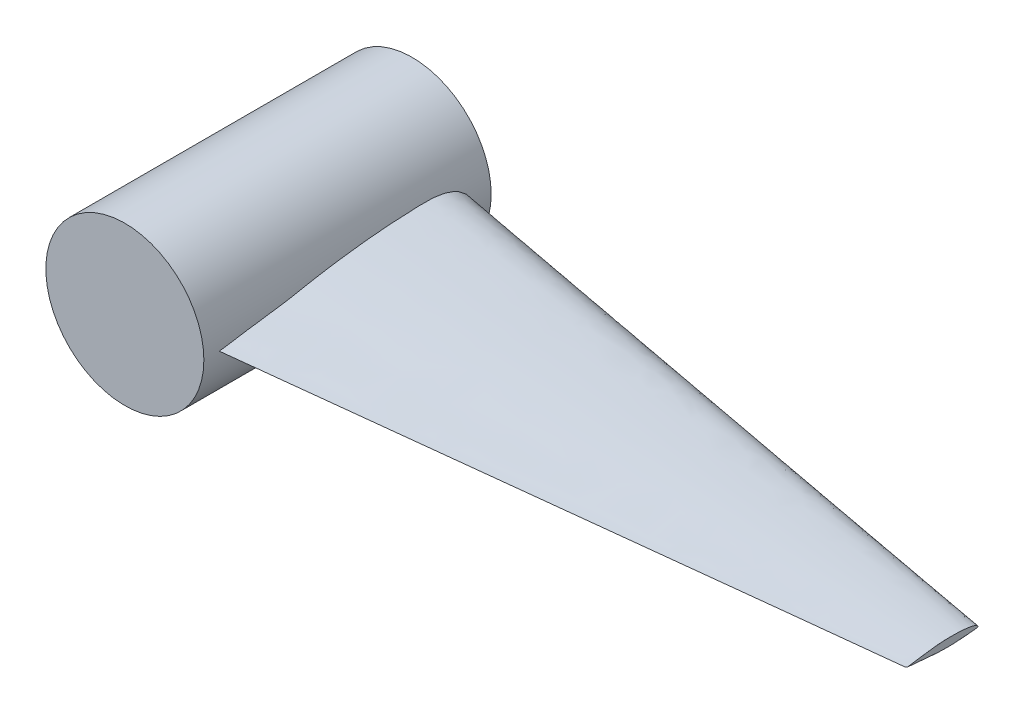
ISO-10303-21;
HEADER;
FILE_DESCRIPTION(('STEP AP214'),'2;1');
FILE_NAME('part.step','',(''),(''),'','','');
FILE_SCHEMA(('AUTOMOTIVE_DESIGN { 1 0 10303 214 1 1 1 1 }'));
ENDSEC;
DATA;
#1=APPLICATION_CONTEXT('core data for automotive mechanical design processes');
#2=APPLICATION_PROTOCOL_DEFINITION('international standard','automotive_design',2000,#1);
#3=PRODUCT_CONTEXT('',#1,'mechanical');
#4=PRODUCT('Part','Part','',(#3));
#5=PRODUCT_RELATED_PRODUCT_CATEGORY('part','',(#4));
#6=PRODUCT_DEFINITION_FORMATION('','',#4);
#7=PRODUCT_DEFINITION_CONTEXT('part definition',#1,'design');
#8=PRODUCT_DEFINITION('design','',#6,#7);
#9=PRODUCT_DEFINITION_SHAPE('','',#8);
#10=(LENGTH_UNIT() NAMED_UNIT(*) SI_UNIT(.MILLI.,.METRE.));
#11=(NAMED_UNIT(*) PLANE_ANGLE_UNIT() SI_UNIT($,.RADIAN.));
#12=(NAMED_UNIT(*) SI_UNIT($,.STERADIAN.) SOLID_ANGLE_UNIT());
#13=UNCERTAINTY_MEASURE_WITH_UNIT(LENGTH_MEASURE(1.E-05),#10,'distance_accuracy_value','');
#14=(GEOMETRIC_REPRESENTATION_CONTEXT(3) GLOBAL_UNCERTAINTY_ASSIGNED_CONTEXT((#13)) GLOBAL_UNIT_ASSIGNED_CONTEXT((#10,
#11,#12)) REPRESENTATION_CONTEXT('',''));
#15=CARTESIAN_POINT('',(0.,0.,0.));
#16=DIRECTION('',(0.,0.,1.));
#17=DIRECTION('',(1.,0.,0.));
#18=AXIS2_PLACEMENT_3D('',#15,#16,#17);
#19=CARTESIAN_POINT('',(0.,0.,-254.));
#20=DIRECTION('',(0.,0.,1.));
#21=DIRECTION('',(1.,0.,0.));
#22=AXIS2_PLACEMENT_3D('',#19,#20,#21);
#23=CYLINDRICAL_SURFACE('',#22,139.7);
#24=CARTESIAN_POINT('',(0.,0.,-254.));
#25=DIRECTION('',(0.,0.,1.));
#26=DIRECTION('',(1.,0.,0.));
#27=AXIS2_PLACEMENT_3D('',#24,#25,#26);
#28=CIRCLE('',#27,139.7);
#29=CARTESIAN_POINT('',(139.7,0.,-254.));
#30=VERTEX_POINT('',#29);
#31=EDGE_CURVE('E13',#30,#30,#28,.T.);
#32=ORIENTED_EDGE('',*,*,#31,.T.);
#33=EDGE_LOOP('',(#32));
#34=FACE_BOUND('',#33,.T.);
#35=CARTESIAN_POINT('',(0.,0.,254.));
#36=DIRECTION('',(0.,0.,1.));
#37=DIRECTION('',(1.,0.,0.));
#38=AXIS2_PLACEMENT_3D('',#35,#36,#37);
#39=CIRCLE('',#38,139.7);
#40=CARTESIAN_POINT('',(139.7,0.,254.));
#41=VERTEX_POINT('',#40);
#42=EDGE_CURVE('E91',#41,#41,#39,.T.);
#43=ORIENTED_EDGE('',*,*,#42,.F.);
#44=EDGE_LOOP('',(#43));
#45=FACE_BOUND('',#44,.T.);
#46=ADVANCED_FACE('F85',(#34,#45),#23,.T.);
#47=CARTESIAN_POINT('',(0.,0.,-254.));
#48=DIRECTION('',(0.,0.,1.));
#49=DIRECTION('',(1.,0.,0.));
#50=AXIS2_PLACEMENT_3D('',#47,#48,#49);
#51=PLANE('',#50);
#52=ORIENTED_EDGE('',*,*,#31,.F.);
#53=EDGE_LOOP('',(#52));
#54=FACE_BOUND('',#53,.T.);
#55=ADVANCED_FACE('F100',(#54),#51,.F.);
#56=CARTESIAN_POINT('',(0.,0.,254.));
#57=DIRECTION('',(0.,0.,1.));
#58=DIRECTION('',(1.,0.,0.));
#59=AXIS2_PLACEMENT_3D('',#56,#57,#58);
#60=PLANE('',#59);
#61=ORIENTED_EDGE('',*,*,#42,.T.);
#62=EDGE_LOOP('',(#61));
#63=FACE_BOUND('',#62,.T.);
#64=ADVANCED_FACE('F97',(#63),#60,.T.);
#65=CLOSED_SHELL('',(#46,#55,#64));
#66=MANIFOLD_SOLID_BREP('B2',#65);
#67=CARTESIAN_POINT('',(1231.9,2.62273754624969E-12,2.62273754624969E-12));
#68=DIRECTION('',(1.,0.,0.));
#69=DIRECTION('',(0.,0.,-1.));
#70=AXIS2_PLACEMENT_3D('',#67,#68,#69);
#71=PLANE('',#70);
#72=CARTESIAN_POINT('',(1231.9,0.1003808,102.934907375439));
#73=CARTESIAN_POINT('',(1231.9,0.0578525268354139,103.250356661608));
#74=CARTESIAN_POINT('',(1231.9,0.0153242536708278,103.565805947778));
#75=CARTESIAN_POINT('',(1231.9,-0.0272040194937584,103.881255233947));
#76=CARTESIAN_POINT('',(1231.9,-0.0272261396690082,103.881419308173));
#77=CARTESIAN_POINT('',(1231.9,-0.0272703800195081,103.881747456625));
#78=CARTESIAN_POINT('',(1231.9,-0.0286565308094481,103.88175049087));
#79=CARTESIAN_POINT('',(1231.9,-0.0286815415989882,103.881420319588));
#80=CARTESIAN_POINT('',(1231.9,-0.0286940469937583,103.881255233947));
#81=CARTESIAN_POINT('',(1231.9,-0.0525896313291721,103.565805947778));
#82=CARTESIAN_POINT('',(1231.9,-0.0764852156645861,103.250356661608));
#83=CARTESIAN_POINT('',(1231.9,-0.1003808,102.934907375439));
#84=CARTESIAN_POINT('',(1231.9,-0.417269682202413,98.7516084745762));
#85=CARTESIAN_POINT('',(1231.9,-1.0512540013073,90.3822839124685));
#86=CARTESIAN_POINT('',(1231.9,-2.17070698962965,77.8410792882466));
#87=CARTESIAN_POINT('',(1231.9,-3.21498348376973,65.2924448238588));
#88=CARTESIAN_POINT('',(1231.9,-4.13319408439642,54.8424833197852));
#89=CARTESIAN_POINT('',(1231.9,-4.67705432307556,46.4741424696112));
#90=CARTESIAN_POINT('',(1231.9,-4.95235359886187,40.1992202803191));
#91=CARTESIAN_POINT('',(1231.9,-5.10030374065839,33.9237788363238));
#92=CARTESIAN_POINT('',(1231.9,-5.06174329405863,27.6484477116856));
#93=CARTESIAN_POINT('',(1231.9,-4.91739345156604,21.3704487859247));
#94=CARTESIAN_POINT('',(1231.9,-4.47861824253753,15.103393193739));
#95=CARTESIAN_POINT('',(1231.9,-4.19541807838513,8.82179561143663));
#96=CARTESIAN_POINT('',(1231.9,-3.65754706539852,2.5515599119799));
#97=CARTESIAN_POINT('',(1231.9,-3.08108017308395,-3.71951164523088));
#98=CARTESIAN_POINT('',(1231.9,-2.62840657573793,-8.95113783479889));
#99=CARTESIAN_POINT('',(1231.9,-2.18061623347464,-13.1304478154078));
#100=CARTESIAN_POINT('',(1231.9,-1.86028146891209,-16.2692997273482));
#101=CARTESIAN_POINT('',(1231.9,-1.57477758176331,-18.8973433944753));
#102=CARTESIAN_POINT('',(1231.9,-1.21744020538741,-20.6635410878993));
#103=CARTESIAN_POINT('',(1231.9,-1.01649086180921,-21.5093293946328));
#104=CARTESIAN_POINT('',(1231.9,-0.827015652011224,-21.9209623295264));
#105=CARTESIAN_POINT('',(1231.9,-0.611069386440118,-22.348919571251));
#106=CARTESIAN_POINT('',(1231.9,0.0809911515844077,-22.6778303421969));
#107=CARTESIAN_POINT('',(1231.9,0.779185751573777,-22.3300581965528));
#108=CARTESIAN_POINT('',(1231.9,1.24585794147608,-21.9365230234994));
#109=CARTESIAN_POINT('',(1231.9,1.62757054457892,-21.5155439232277));
#110=CARTESIAN_POINT('',(1231.9,2.21558407901577,-20.698730076763));
#111=CARTESIAN_POINT('',(1231.9,3.19627291612298,-18.9553504155205));
#112=CARTESIAN_POINT('',(1231.9,4.2382336433096,-16.3193241977378));
#113=CARTESIAN_POINT('',(1231.9,5.17140663030088,-13.156390559054));
#114=CARTESIAN_POINT('',(1231.9,6.13468412144805,-8.97980553439834));
#115=CARTESIAN_POINT('',(1231.9,6.92396433800448,-3.7372285578663));
#116=CARTESIAN_POINT('',(1231.9,7.6434797599233,2.5419973575698));
#117=CARTESIAN_POINT('',(1231.9,8.11812753159619,8.82150905615575));
#118=CARTESIAN_POINT('',(1231.9,8.29053392869502,15.1017420779062));
#119=CARTESIAN_POINT('',(1231.9,8.558534989163,21.3734191008187));
#120=CARTESIAN_POINT('',(1231.9,8.51880528719244,27.6501142954071));
#121=CARTESIAN_POINT('',(1231.9,8.40982488462759,33.9254297873578));
#122=CARTESIAN_POINT('',(1231.9,8.13218611071437,40.2015509300742));
#123=CARTESIAN_POINT('',(1231.9,7.69431195149048,46.4775249510334));
#124=CARTESIAN_POINT('',(1231.9,6.88340368473107,54.8521651477331));
#125=CARTESIAN_POINT('',(1231.9,5.5209907762197,65.3092190404685));
#126=CARTESIAN_POINT('',(1231.9,3.64824659602947,77.8391627436256));
#127=CARTESIAN_POINT('',(1231.9,1.79323804069325,90.378305180543));
#128=CARTESIAN_POINT('',(1231.9,0.664431665266303,98.7511155218887));
#129=CARTESIAN_POINT('',(1231.9,0.1003808,102.934907375439));
#130=B_SPLINE_CURVE_WITH_KNOTS('',3,(#72,#73,#74,#75,#76,#77,#78,#79,#80,#81,#82,#83,#84,#85,
#86,#87,#88,#89,#90,#91,#92,#93,#94,#95,#96,#97,#98,#99,#100,#101,#102,#103,#104,#105,#106,#107,
#108,#109,#110,#111,#112,#113,#114,#115,#116,#117,#118,#119,#120,#121,#122,#123,#124,#125,#126,
#127,#128,#129),.UNSPECIFIED.,.T.,.F.,(4,3,1,1,3,3,1,1,1,1,1,1,1,1,1,1,1,1,1,1,1,1,1,1,1,1,1,1,
1,1,1,1,1,1,1,1,1,1,1,1,1,1,1,1,1,1,1,1,1,4),(0.,0.00372715795143563,0.0037290965532395,
0.00373103515504325,0.00373297375684711,0.00743729687078698,0.0565618043285644,
0.105718332152071,0.154870687771699,0.204010817526637,0.228548792017455,0.253060359391852,
0.277554159314199,0.302042229789993,0.326539701729691,0.35106873032683,0.375594971831613,
0.400161082625523,0.424747933069218,0.449339221964373,0.461649196379859,0.473959170795345,
0.486303002909542,0.492546210424397,0.495089179224088,0.496426853888338,0.497854730074794,
0.500636449154535,0.504276833423401,0.506189397567921,0.507853131952137,0.510899486539756,
0.517964397502406,0.531206791634393,0.54398983744939,0.556558965161132,0.581366088598264,
0.606012571725114,0.630567402561298,0.655072951002357,0.679573360159687,0.704061234733268,
0.728554006392103,0.753065573766501,0.777613370318065,0.802213826225178,0.851576813971277,
0.901071794260254,0.95056677454923,1.),.UNSPECIFIED.);
#131=CARTESIAN_POINT('',(1231.9,0.1003808,102.934907375439));
#132=VERTEX_POINT('',#131);
#133=EDGE_CURVE('E84',#132,#132,#130,.T.);
#134=ORIENTED_EDGE('',*,*,#133,.T.);
#135=EDGE_LOOP('',(#134));
#136=FACE_BOUND('',#135,.T.);
#137=ADVANCED_FACE('F139',(#136),#71,.T.);
#138=OPEN_SHELL('',(#137));
#139=SHELL_BASED_SURFACE_MODEL('B8',(#138));
#140=CARTESIAN_POINT('',(0.,0.,0.));
#141=DIRECTION('',(-1.,0.,0.));
#142=DIRECTION('',(0.,0.,1.));
#143=AXIS2_PLACEMENT_3D('',#140,#141,#142);
#144=PLANE('',#143);
#145=CARTESIAN_POINT('',(0.,0.144788443865577,241.299944654891));
#146=CARTESIAN_POINT('',(0.,0.0777003705492685,241.895364525818));
#147=CARTESIAN_POINT('',(0.,-0.0567866928298426,243.102704480422));
#148=CARTESIAN_POINT('',(0.,-0.147058392792937,241.23256915172));
#149=CARTESIAN_POINT('',(0.,-0.301491598593268,238.25172523764));
#150=CARTESIAN_POINT('',(0.,-1.03994476595416,225.838699740826));
#151=CARTESIAN_POINT('',(0.,-2.66200675131926,213.281180425386));
#152=CARTESIAN_POINT('',(0.,-4.73930316036072,188.634037520463));
#153=CARTESIAN_POINT('',(0.,-6.92135758938836,161.713152289455));
#154=CARTESIAN_POINT('',(0.,-10.53016706284,128.183115663699));
#155=CARTESIAN_POINT('',(0.,-14.4426517985778,99.4388123296694));
#156=CARTESIAN_POINT('',(0.,-18.2272169843898,70.864003289634));
#157=CARTESIAN_POINT('',(0.,-20.253473736349,54.5188584987011));
#158=CARTESIAN_POINT('',(0.,-21.9546617619918,39.5655706179138));
#159=CARTESIAN_POINT('',(0.,-23.1816635838245,27.8472314383957));
#160=CARTESIAN_POINT('',(0.,-24.3821935637638,15.128115176118));
#161=CARTESIAN_POINT('',(0.,-25.373961820276,3.39492600133725));
#162=CARTESIAN_POINT('',(0.,-26.3305691423975,-9.32996665794859));
#163=CARTESIAN_POINT('',(0.,-27.120662220444,-21.0810026259953));
#164=CARTESIAN_POINT('',(0.,-27.9673106163807,-34.9441944839179));
#165=CARTESIAN_POINT('',(0.,-28.5839513658834,-46.7061128950724));
#166=CARTESIAN_POINT('',(0.,-29.0911822573746,-58.6204981027553));
#167=CARTESIAN_POINT('',(0.,-29.4746092400472,-69.2582244915911));
#168=CARTESIAN_POINT('',(0.,-29.8840788266327,-83.202586351335));
#169=CARTESIAN_POINT('',(0.,-30.1591022699629,-95.8198922370995));
#170=CARTESIAN_POINT('',(0.,-30.3725010986781,-108.735724295835));
#171=CARTESIAN_POINT('',(0.,-30.4993261611017,-119.342275085077));
#172=CARTESIAN_POINT('',(0.,-30.5912498673501,-132.871805304554));
#173=CARTESIAN_POINT('',(0.,-30.5586387264164,-144.536287645946));
#174=CARTESIAN_POINT('',(0.,-30.3339801622526,-157.416352533227));
#175=CARTESIAN_POINT('',(0.,-29.6401732545879,-168.461688270843));
#176=CARTESIAN_POINT('',(0.,-27.4489271373718,-181.186817565267));
#177=CARTESIAN_POINT('',(0.,-25.0161188932733,-192.736720588934));
#178=CARTESIAN_POINT('',(0.,-23.6431038958614,-201.820139323343));
#179=CARTESIAN_POINT('',(0.,-21.3848922659402,-208.993581592136));
#180=CARTESIAN_POINT('',(0.,-18.9788039920874,-213.419469026814));
#181=CARTESIAN_POINT('',(0.,-15.3623977535589,-219.868370753213));
#182=CARTESIAN_POINT('',(0.,-12.894139184339,-224.66955517833));
#183=CARTESIAN_POINT('',(0.,-9.22987213402648,-230.663299255344));
#184=CARTESIAN_POINT('',(0.,-6.71852338724773,-233.968825808489));
#185=CARTESIAN_POINT('',(0.,-4.10135768701016,-236.571547446773));
#186=CARTESIAN_POINT('',(0.,-2.72873738723392,-237.763146443635));
#187=CARTESIAN_POINT('',(0.,-0.978430841697623,-238.902008655179));
#188=CARTESIAN_POINT('',(0.,0.502851479557123,-239.691823096477));
#189=CARTESIAN_POINT('',(0.,1.80350011732377,-240.246218422895));
#190=CARTESIAN_POINT('',(0.,3.03667337681265,-240.651682084256));
#191=CARTESIAN_POINT('',(0.,4.34014889838884,-240.966654055654));
#192=CARTESIAN_POINT('',(0.,6.18350502042997,-241.257871564671));
#193=CARTESIAN_POINT('',(0.,7.60604770037491,-241.320092940452));
#194=CARTESIAN_POINT('',(0.,9.76693419163617,-241.27370421335));
#195=CARTESIAN_POINT('',(0.,11.6248227085678,-241.073687442578));
#196=CARTESIAN_POINT('',(0.,13.7267415137745,-240.566764917199));
#197=CARTESIAN_POINT('',(0.,14.8690618467352,-240.210231458943));
#198=CARTESIAN_POINT('',(0.,16.19500583098,-239.73883673656));
#199=CARTESIAN_POINT('',(0.,17.3588098425809,-239.217044838416));
#200=CARTESIAN_POINT('',(0.,18.8087632732904,-238.417711904317));
#201=CARTESIAN_POINT('',(0.,20.9488980726215,-237.070120775956));
#202=CARTESIAN_POINT('',(0.,22.8575837599116,-235.625177997857));
#203=CARTESIAN_POINT('',(0.,25.6006483962156,-232.877202438314));
#204=CARTESIAN_POINT('',(0.,28.1478136488566,-229.22455492491));
#205=CARTESIAN_POINT('',(0.,31.9659718128666,-223.57034603849));
#206=CARTESIAN_POINT('',(0.,35.1600228976263,-217.905910600061));
#207=CARTESIAN_POINT('',(0.,37.5541079201024,-211.820830692384));
#208=CARTESIAN_POINT('',(0.,39.2479011652027,-205.930592941204));
#209=CARTESIAN_POINT('',(0.,40.709432435659,-199.712498758831));
#210=CARTESIAN_POINT('',(0.,42.5589668570684,-189.680098753831));
#211=CARTESIAN_POINT('',(0.,43.4757033161673,-178.803635209961));
#212=CARTESIAN_POINT('',(0.,43.8857537485595,-164.447888477241));
#213=CARTESIAN_POINT('',(0.,43.8375966604243,-154.906565743939));
#214=CARTESIAN_POINT('',(0.,43.5703567957637,-141.09760373014));
#215=CARTESIAN_POINT('',(0.,43.2450367586771,-131.046005488648));
#216=CARTESIAN_POINT('',(0.,42.6258920136827,-115.991835855987));
#217=CARTESIAN_POINT('',(0.,42.0807353396725,-104.645610739935));
#218=CARTESIAN_POINT('',(0.,41.314111352033,-90.1610334428075));
#219=CARTESIAN_POINT('',(0.,40.7549990560645,-80.1339686227491));
#220=CARTESIAN_POINT('',(0.,39.9247512735249,-66.9815801589921));
#221=CARTESIAN_POINT('',(0.,39.3113973137302,-58.7065326735991));
#222=CARTESIAN_POINT('',(0.,38.1835096253861,-44.2584932724856));
#223=CARTESIAN_POINT('',(0.,37.4284832313508,-35.1579041671688));
#224=CARTESIAN_POINT('',(0.,35.8919605824467,-18.9912942708213));
#225=CARTESIAN_POINT('',(0.,34.8340583599446,-9.08206591022316));
#226=CARTESIAN_POINT('',(0.,33.0586087758142,6.24338828354298));
#227=CARTESIAN_POINT('',(0.,31.7315455084347,17.0089907089954));
#228=CARTESIAN_POINT('',(0.,29.838396629525,31.5111275878528));
#229=CARTESIAN_POINT('',(0.,28.6616840468253,40.1128211772237));
#230=CARTESIAN_POINT('',(0.,26.6257553230861,54.5293601900039));
#231=CARTESIAN_POINT('',(0.,24.2069282610959,70.9006052459385));
#232=CARTESIAN_POINT('',(0.,19.2422421117045,102.604407703476));
#233=CARTESIAN_POINT('',(0.,14.6288568753775,132.013301323053));
#234=CARTESIAN_POINT('',(0.,10.2330235514548,165.674575774059));
#235=CARTESIAN_POINT('',(0.,8.12252718520493,185.465808698908));
#236=CARTESIAN_POINT('',(0.,4.85207414209411,209.607389259597));
#237=CARTESIAN_POINT('',(0.,2.55003100328343,219.952942967667));
#238=CARTESIAN_POINT('',(0.,0.144788443865577,241.299944654891));
#239=B_SPLINE_CURVE_WITH_KNOTS('',3,(#145,#146,#147,#148,#149,#150,#151,#152,#153,#154,#155,
#156,#157,#158,#159,#160,#161,#162,#163,#164,#165,#166,#167,#168,#169,#170,#171,#172,#173,#174,
#175,#176,#177,#178,#179,#180,#181,#182,#183,#184,#185,#186,#187,#188,#189,#190,#191,#192,#193,
#194,#195,#196,#197,#198,#199,#200,#201,#202,#203,#204,#205,#206,#207,#208,#209,#210,#211,#212,
#213,#214,#215,#216,#217,#218,#219,#220,#221,#222,#223,#224,#225,#226,#227,#228,#229,#230,#231,
#232,#233,#234,#235,#236,#237,#238),.UNSPECIFIED.,.T.,.F.,(4,1,1,1,1,1,1,1,1,1,1,1,1,1,1,1,1,1,
1,1,1,1,1,1,1,1,1,1,1,1,1,1,1,1,1,1,1,1,1,1,1,1,1,1,1,1,1,1,1,1,1,1,1,1,1,1,1,1,1,1,1,1,1,1,1,1,
1,1,1,1,1,1,1,1,1,1,1,1,1,1,1,1,1,1,1,1,1,1,1,1,1,4),(0.,0.00120988816400813,
0.00241459661074461,0.00372715795143563,0.00743729687078698,0.0309433201539792,
0.0565618043285644,0.0838079601235979,0.105718332152071,0.154870687771699,0.1727447748775,
0.193230964335824,0.204010817526637,0.217802078697554,0.228548792017455,0.242277916839808,
0.253060359391852,0.266767219292103,0.277554159314199,0.294658520933296,0.302042229789993,
0.313270448670582,0.326539701729691,0.343826968977655,0.35106873032683,0.36522131450135,
0.375594971831613,0.391624537462875,0.400161082625523,0.41406108851159,0.424747933069218,
0.438974099827609,0.449339221964373,0.45196066184842,0.461649196379859,0.464350317244791,
0.473959170795345,0.477814575652468,0.485429622889384,0.486303002909542,0.488842665522006,
0.490860526208461,0.492546210424397,0.493855900746361,0.495089179224088,0.496426853888338,
0.497854730074794,0.500636433341055,0.500636449154535,0.504276833423401,0.506189397567921,
0.507092156527246,0.507853131952137,0.510394580976236,0.510899486539756,0.512815649468572,
0.517964397502406,0.517992592110853,0.52447916633929,0.531206791634393,0.538311411882904,
0.54398983744939,0.550790307406691,0.556558965161132,0.563093377662114,0.581366088598264,
0.589186037278411,0.606012571725114,0.609952299352341,0.630567402561298,0.636128987509159,
0.655072951002357,0.664590133650393,0.679573360159687,0.685150580539931,0.704061234733268,
0.704425535399166,0.728554006392103,0.731409856246585,0.753065573766501,0.758401961531186,
0.777613370318065,0.785545524030473,0.802213826225178,0.803636535083191,0.829106870133368,
0.851576813971277,0.901071794260254,0.919833809060581,0.95056677454923,0.956623072323336,1.),.UNSPECIFIED.);
#240=CARTESIAN_POINT('',(0.,0.144788443865577,241.299944654891));
#241=VERTEX_POINT('',#240);
#242=EDGE_CURVE('E138',#241,#241,#239,.T.);
#243=ORIENTED_EDGE('',*,*,#242,.F.);
#244=EDGE_LOOP('',(#243));
#245=FACE_BOUND('',#244,.T.);
#246=ADVANCED_FACE('F167',(#245),#144,.T.);
#247=OPEN_SHELL('',(#246));
#248=SHELL_BASED_SURFACE_MODEL('B79',(#247));
#249=CARTESIAN_POINT('',(0.,0.144788443865577,241.299944654891));
#250=CARTESIAN_POINT('',(1231.9,0.100380742666225,102.934907800706));
#251=CARTESIAN_POINT('',(0.,0.0777003705492685,241.895364525818));
#252=CARTESIAN_POINT('',(1231.9,0.0852006497967138,103.085588380846));
#253=CARTESIAN_POINT('',(0.,-0.0567866928298426,243.102704480422));
#254=CARTESIAN_POINT('',(1231.9,0.0547891454309801,103.390388923212));
#255=CARTESIAN_POINT('',(0.,-0.147058392792937,241.23256915172));
#256=CARTESIAN_POINT('',(1231.9,0.01050872858406,103.767370963349));
#257=CARTESIAN_POINT('',(0.,-0.301491598593268,238.25172523764));
#258=CARTESIAN_POINT('',(1231.9,-0.0535984612337215,104.050362792936));
#259=CARTESIAN_POINT('',(0.,-1.03994476595416,225.838699740826));
#260=CARTESIAN_POINT('',(1231.9,-0.204815880802011,100.34357994304));
#261=CARTESIAN_POINT('',(0.,-2.66200675131926,213.281180425386));
#262=CARTESIAN_POINT('',(1231.9,-0.536435390463784,95.4861051607936));
#263=CARTESIAN_POINT('',(0.,-4.73930316036072,188.634037520463));
#264=CARTESIAN_POINT('',(1231.9,-1.08956009040158,90.5264327571759));
#265=CARTESIAN_POINT('',(0.,-6.92135758938836,161.713152289455));
#266=CARTESIAN_POINT('',(1231.9,-1.63909134888173,84.195768363094));
#267=CARTESIAN_POINT('',(0.,-10.53016706284,128.183115663699));
#268=CARTESIAN_POINT('',(1231.9,-2.358908689239,75.3368677011081));
#269=CARTESIAN_POINT('',(0.,-14.4426517985778,99.4388123296694));
#270=CARTESIAN_POINT('',(1231.9,-2.99357144661155,67.9542379355756));
#271=CARTESIAN_POINT('',(0.,-18.2272169843898,70.864003289634));
#272=CARTESIAN_POINT('',(1231.9,-3.63738888679172,60.5302520487528));
#273=CARTESIAN_POINT('',(0.,-20.253473736349,54.5188584987011));
#274=CARTESIAN_POINT('',(1231.9,-3.98500279705649,56.3340881440189));
#275=CARTESIAN_POINT('',(0.,-21.9546617619918,39.5655706179138));
#276=CARTESIAN_POINT('',(1231.9,-4.27611885051255,52.4864729742628));
#277=CARTESIAN_POINT('',(0.,-23.1816635838245,27.8472314383957));
#278=CARTESIAN_POINT('',(1231.9,-4.48171270688213,49.4771113983404));
#279=CARTESIAN_POINT('',(0.,-24.3821935637638,15.128115176118));
#280=CARTESIAN_POINT('',(1231.9,-4.67441339819583,46.2171620509656));
#281=CARTESIAN_POINT('',(0.,-25.373961820276,3.39492600133725));
#282=CARTESIAN_POINT('',(1231.9,-4.8203154147618,43.2096137818323));
#283=CARTESIAN_POINT('',(0.,-26.3305691423975,-9.32996665794859));
#284=CARTESIAN_POINT('',(1231.9,-4.94483789655141,39.9473584652721));
#285=CARTESIAN_POINT('',(0.,-27.120662220444,-21.0810026259953));
#286=CARTESIAN_POINT('',(1231.9,-5.02928775323337,36.9356926222336));
#287=CARTESIAN_POINT('',(0.,-27.9673106163807,-34.9441944839179));
#288=CARTESIAN_POINT('',(1231.9,-5.08349160670443,33.3837364243269));
#289=CARTESIAN_POINT('',(0.,-28.5839513658834,-46.7061128950724));
#290=CARTESIAN_POINT('',(1231.9,-5.07847468497302,30.3712165569801));
#291=CARTESIAN_POINT('',(0.,-29.0911822573746,-58.6204981027553));
#292=CARTESIAN_POINT('',(1231.9,-5.04178740813958,27.3209702680804));
#293=CARTESIAN_POINT('',(0.,-29.4746092400472,-69.2582244915911));
#294=CARTESIAN_POINT('',(1231.9,-4.99161213226085,24.59833585927));
#295=CARTESIAN_POINT('',(0.,-29.8840788266327,-83.202586351335));
#296=CARTESIAN_POINT('',(1231.9,-4.87126903824623,21.0318649053898));
#297=CARTESIAN_POINT('',(0.,-30.1591022699629,-95.8198922370995));
#298=CARTESIAN_POINT('',(1231.9,-4.6681287341707,17.8101856041861));
#299=CARTESIAN_POINT('',(0.,-30.3725010986781,-108.735724295835));
#300=CARTESIAN_POINT('',(1231.9,-4.46625712954357,14.5127092042189));
#301=CARTESIAN_POINT('',(0.,-30.4993261611017,-119.342275085077));
#302=CARTESIAN_POINT('',(1231.9,-4.32982124496079,11.8029609716128));
#303=CARTESIAN_POINT('',(0.,-30.5912498673501,-132.871805304554));
#304=CARTESIAN_POINT('',(1231.9,-4.13343820094195,8.34520431457759));
#305=CARTESIAN_POINT('',(0.,-30.5586387264164,-144.536287645946));
#306=CARTESIAN_POINT('',(1231.9,-3.89935362698862,5.37042198752392));
#307=CARTESIAN_POINT('',(0.,-30.3339801622526,-157.416352533227));
#308=CARTESIAN_POINT('',(1231.9,-3.61205961609949,2.09768393819022));
#309=CARTESIAN_POINT('',(0.,-29.6401732545879,-168.461688270843));
#310=CARTESIAN_POINT('',(1231.9,-3.35685321062346,-0.719525950427102));
#311=CARTESIAN_POINT('',(0.,-27.4489271373718,-181.186817565267));
#312=CARTESIAN_POINT('',(1231.9,-3.05844064815694,-4.02060982190627));
#313=CARTESIAN_POINT('',(0.,-25.0161188932733,-192.736720588934));
#314=CARTESIAN_POINT('',(1231.9,-2.79533993763719,-7.02186041051319));
#315=CARTESIAN_POINT('',(0.,-23.6431038958614,-201.820139323343));
#316=CARTESIAN_POINT('',(1231.9,-2.57677371238819,-9.33556214070117));
#317=CARTESIAN_POINT('',(0.,-21.3848922659402,-208.993581592136));
#318=CARTESIAN_POINT('',(1231.9,-2.38078839543431,-11.2622040532108));
#319=CARTESIAN_POINT('',(0.,-18.9788039920874,-213.419469026814));
#320=CARTESIAN_POINT('',(1231.9,-2.24488951472144,-12.5370209009561));
#321=CARTESIAN_POINT('',(0.,-15.3623977535589,-219.868370753213));
#322=CARTESIAN_POINT('',(1231.9,-2.05052738571424,-14.4051443940257));
#323=CARTESIAN_POINT('',(0.,-12.894139184339,-224.66955517833));
#324=CARTESIAN_POINT('',(1231.9,-1.90941811835746,-15.7781093709182));
#325=CARTESIAN_POINT('',(0.,-9.22987213402648,-230.663299255344));
#326=CARTESIAN_POINT('',(1231.9,-1.71880303190627,-17.5700517605254));
#327=CARTESIAN_POINT('',(0.,-6.71852338724773,-233.968825808489));
#328=CARTESIAN_POINT('',(1231.9,-1.58666162036721,-18.6164532596887));
#329=CARTESIAN_POINT('',(0.,-4.10135768701016,-236.571547446773));
#330=CARTESIAN_POINT('',(1231.9,-1.43255118036139,-19.5444713229042));
#331=CARTESIAN_POINT('',(0.,-2.72873738723392,-237.763146443635));
#332=CARTESIAN_POINT('',(1231.9,-1.34900804583399,-20.0000169998622));
#333=CARTESIAN_POINT('',(0.,-0.978430841697623,-238.902008655179));
#334=CARTESIAN_POINT('',(1231.9,-1.24213329051211,-20.5223064463236));
#335=CARTESIAN_POINT('',(0.,0.502851479557123,-239.691823096477));
#336=CARTESIAN_POINT('',(1231.9,-1.14971321838178,-20.9412366741978));
#337=CARTESIAN_POINT('',(0.,1.80350011732377,-240.246218422895));
#338=CARTESIAN_POINT('',(1231.9,-1.06752197115016,-21.2945413550623));
#339=CARTESIAN_POINT('',(0.,3.03667337681265,-240.651682084256));
#340=CARTESIAN_POINT('',(1231.9,-0.969744524813743,-21.6108853285909));
#341=CARTESIAN_POINT('',(0.,4.34014889838884,-240.966654055654));
#342=CARTESIAN_POINT('',(1231.9,-0.827015652011223,-21.9209623295264));
#343=CARTESIAN_POINT('',(0.,6.18350502042997,-241.257871564671));
#344=CARTESIAN_POINT('',(1231.9,-0.611070002033376,-22.3489183512827));
#345=CARTESIAN_POINT('',(0.,7.60604770037491,-241.320092940452));
#346=CARTESIAN_POINT('',(1231.9,-0.239949460854077,-22.5252991423017));
#347=CARTESIAN_POINT('',(0.,9.76693419163617,-241.27370421335));
#348=CARTESIAN_POINT('',(1231.9,0.31401426868876,-22.5617610551797));
#349=CARTESIAN_POINT('',(0.,11.6248227085678,-241.073687442578));
#350=CARTESIAN_POINT('',(1231.9,0.779185751573775,-22.3300581965528));
#351=CARTESIAN_POINT('',(0.,13.7267415137745,-240.566764917199));
#352=CARTESIAN_POINT('',(1231.9,1.19664889655122,-21.9780200109551));
#353=CARTESIAN_POINT('',(0.,14.8690618467352,-240.210231458943));
#354=CARTESIAN_POINT('',(1231.9,1.40812588631079,-21.7575626934914));
#355=CARTESIAN_POINT('',(0.,16.19500583098,-239.73883673656));
#356=CARTESIAN_POINT('',(1231.9,1.64429572442571,-21.4855774728633));
#357=CARTESIAN_POINT('',(0.,17.3588098425809,-239.217044838416));
#358=CARTESIAN_POINT('',(1231.9,1.8375667036139,-21.2238367424264));
#359=CARTESIAN_POINT('',(0.,18.8087632732904,-238.417711904317));
#360=CARTESIAN_POINT('',(1231.9,2.07547284710079,-20.873005152238));
#361=CARTESIAN_POINT('',(0.,20.9488980726215,-237.070120775956));
#362=CARTESIAN_POINT('',(1231.9,2.42397478088126,-20.3282719890554));
#363=CARTESIAN_POINT('',(0.,22.8575837599116,-235.625177997857));
#364=CARTESIAN_POINT('',(1231.9,2.71480449000402,-19.7954095421563));
#365=CARTESIAN_POINT('',(0.,25.6006483962156,-232.877202438314));
#366=CARTESIAN_POINT('',(1231.9,3.16179490503977,-18.9043021848297));
#367=CARTESIAN_POINT('',(0.,28.1478136488566,-229.22455492491));
#368=CARTESIAN_POINT('',(1231.9,3.6247109120523,-17.8713108738609));
#369=CARTESIAN_POINT('',(0.,31.9659718128666,-223.57034603849));
#370=CARTESIAN_POINT('',(1231.9,4.2273391068084,-16.2410292977787));
#371=CARTESIAN_POINT('',(0.,35.1600228976263,-217.905910600061));
#372=CARTESIAN_POINT('',(1231.9,4.73020143404247,-14.6518289995595));
#373=CARTESIAN_POINT('',(0.,37.5541079201024,-211.820830692384));
#374=CARTESIAN_POINT('',(1231.9,5.17640848004882,-13.0396955962628));
#375=CARTESIAN_POINT('',(0.,39.2479011652027,-205.930592941204));
#376=CARTESIAN_POINT('',(1231.9,5.54749563243887,-11.5257413358464));
#377=CARTESIAN_POINT('',(0.,40.709432435659,-199.712498758831));
#378=CARTESIAN_POINT('',(1231.9,5.89184820423678,-9.93067745224923));
#379=CARTESIAN_POINT('',(0.,42.5589668570684,-189.680098753831));
#380=CARTESIAN_POINT('',(1231.9,6.37778927499314,-7.36504633608583));
#381=CARTESIAN_POINT('',(0.,43.4757033161673,-178.803635209961));
#382=CARTESIAN_POINT('',(1231.9,6.780041573513,-4.6058165676936));
#383=CARTESIAN_POINT('',(0.,43.8857537485595,-164.447888477241));
#384=CARTESIAN_POINT('',(1231.9,7.24116711215846,-0.96899346616312));
#385=CARTESIAN_POINT('',(0.,43.8375966604243,-154.906565743939));
#386=CARTESIAN_POINT('',(1231.9,7.50417096479169,1.45799070792696));
#387=CARTESIAN_POINT('',(0.,43.5703567957637,-141.09760373014));
#388=CARTESIAN_POINT('',(1231.9,7.82756548170429,4.97742125766032));
#389=CARTESIAN_POINT('',(0.,43.2450367586771,-131.046005488648));
#390=CARTESIAN_POINT('',(1231.9,8.01159935135704,7.54364505102911));
#391=CARTESIAN_POINT('',(0.,42.6258920136827,-115.991835855987));
#392=CARTESIAN_POINT('',(1231.9,8.18871220007644,11.3926896183523));
#393=CARTESIAN_POINT('',(0.,42.0807353396725,-104.645610739935));
#394=CARTESIAN_POINT('',(1231.9,8.2734827386464,14.2972215943775));
#395=CARTESIAN_POINT('',(0.,41.314111352033,-90.1610334428075));
#396=CARTESIAN_POINT('',(1231.9,8.41460043067166,18.0051118160632));
#397=CARTESIAN_POINT('',(0.,40.7549990560645,-80.1339686227491));
#398=CARTESIAN_POINT('',(1231.9,8.49981337389804,20.5723055145991));
#399=CARTESIAN_POINT('',(0.,39.9247512735249,-66.9815801589921));
#400=CARTESIAN_POINT('',(1231.9,8.54227284393725,23.942619579953));
#401=CARTESIAN_POINT('',(0.,39.3113973137302,-58.7065326735991));
#402=CARTESIAN_POINT('',(1231.9,8.52616968834918,26.0653775369235));
#403=CARTESIAN_POINT('',(0.,38.1835096253861,-44.2584932724856));
#404=CARTESIAN_POINT('',(1231.9,8.48195189229382,29.772197028198));
#405=CARTESIAN_POINT('',(0.,37.4284832313508,-35.1579041671688));
#406=CARTESIAN_POINT('',(1231.9,8.44092966907174,32.1074658944995));
#407=CARTESIAN_POINT('',(0.,35.8919605824467,-18.9912942708213));
#408=CARTESIAN_POINT('',(1231.9,8.30659389020979,36.2589721341462));
#409=CARTESIAN_POINT('',(0.,34.8340583599446,-9.08206591022316));
#410=CARTESIAN_POINT('',(1231.9,8.19016051192509,38.8054893149123));
#411=CARTESIAN_POINT('',(0.,33.0586087758142,6.24338828354298));
#412=CARTESIAN_POINT('',(1231.9,7.95474265880854,42.7450439999088));
#413=CARTESIAN_POINT('',(0.,31.7315455084347,17.0089907089954));
#414=CARTESIAN_POINT('',(1231.9,7.75358646520227,45.5121574630218));
#415=CARTESIAN_POINT('',(0.,29.838396629525,31.5111275878528));
#416=CARTESIAN_POINT('',(1231.9,7.42699720590235,49.2370169479801));
#417=CARTESIAN_POINT('',(0.,28.6616840468253,40.1128211772237));
#418=CARTESIAN_POINT('',(1231.9,7.2049768470182,51.4478127561742));
#419=CARTESIAN_POINT('',(0.,26.6257553230861,54.5293601900039));
#420=CARTESIAN_POINT('',(1231.9,6.80323724982378,55.1528364801526));
#421=CARTESIAN_POINT('',(0.,24.2069282610959,70.9006052459385));
#422=CARTESIAN_POINT('',(1231.9,6.29818201021761,59.3571503654039));
#423=CARTESIAN_POINT('',(0.,19.2422421117045,102.604407703476));
#424=CARTESIAN_POINT('',(1231.9,5.18120772200492,67.5910371713695));
#425=CARTESIAN_POINT('',(0.,14.6288568753775,132.013301323053));
#426=CARTESIAN_POINT('',(1231.9,4.04136829853099,75.0621699988779));
#427=CARTESIAN_POINT('',(0.,10.2330235514548,165.674575774059));
#428=CARTESIAN_POINT('',(1231.9,2.78694400548299,83.8943281725454));
#429=CARTESIAN_POINT('',(0.,8.12252718520493,185.465808698908));
#430=CARTESIAN_POINT('',(1231.9,2.10283610335003,88.6340668186484));
#431=CARTESIAN_POINT('',(0.,4.85207414209411,209.607389259597));
#432=CARTESIAN_POINT('',(1231.9,1.17947335714432,94.3741902572955));
#433=CARTESIAN_POINT('',(0.,2.55003100328343,219.952942967667));
#434=CARTESIAN_POINT('',(1231.9,0.644617648286051,97.5327054968523));
#435=CARTESIAN_POINT('',(0.,0.144788443865577,241.299944654891));
#436=CARTESIAN_POINT('',(1231.9,0.100380742666225,102.934907800706));
#437=B_SPLINE_SURFACE_WITH_KNOTS('',3,1,((#249,#250),(#251,#252),(#253,#254),(#255,#256),(#257,
#258),(#259,#260),(#261,#262),(#263,#264),(#265,#266),(#267,#268),(#269,#270),(#271,#272),(#273,
#274),(#275,#276),(#277,#278),(#279,#280),(#281,#282),(#283,#284),(#285,#286),(#287,#288),(#289,
#290),(#291,#292),(#293,#294),(#295,#296),(#297,#298),(#299,#300),(#301,#302),(#303,#304),(#305,
#306),(#307,#308),(#309,#310),(#311,#312),(#313,#314),(#315,#316),(#317,#318),(#319,#320),(#321,
#322),(#323,#324),(#325,#326),(#327,#328),(#329,#330),(#331,#332),(#333,#334),(#335,#336),(#337,
#338),(#339,#340),(#341,#342),(#343,#344),(#345,#346),(#347,#348),(#349,#350),(#351,#352),(#353,
#354),(#355,#356),(#357,#358),(#359,#360),(#361,#362),(#363,#364),(#365,#366),(#367,#368),(#369,
#370),(#371,#372),(#373,#374),(#375,#376),(#377,#378),(#379,#380),(#381,#382),(#383,#384),(#385,
#386),(#387,#388),(#389,#390),(#391,#392),(#393,#394),(#395,#396),(#397,#398),(#399,#400),(#401,
#402),(#403,#404),(#405,#406),(#407,#408),(#409,#410),(#411,#412),(#413,#414),(#415,#416),(#417,
#418),(#419,#420),(#421,#422),(#423,#424),(#425,#426),(#427,#428),(#429,#430),(#431,#432),(#433,
#434),(#435,#436)),.UNSPECIFIED.,.T.,.F.,.F.,(4,1,1,1,1,1,1,1,1,1,1,1,1,1,1,1,1,1,1,1,1,1,1,1,1,
1,1,1,1,1,1,1,1,1,1,1,1,1,1,1,1,1,1,1,1,1,1,1,1,1,1,1,1,1,1,1,1,1,1,1,1,1,1,1,1,1,1,1,1,1,1,1,1,
1,1,1,1,1,1,1,1,1,1,1,1,1,1,1,1,1,1,4),(2,2),(0.,0.00120988816400813,0.00241459661074461,
0.00372715795143563,0.00743729687078698,0.0309433201539792,0.0565618043285644,
0.0838079601235979,0.105718332152071,0.154870687771699,0.1727447748775,0.193230964335824,
0.204010817526637,0.217802078697554,0.228548792017455,0.242277916839808,0.253060359391852,
0.266767219292103,0.277554159314199,0.294658520933296,0.302042229789993,0.313270448670582,
0.326539701729691,0.343826968977655,0.35106873032683,0.36522131450135,0.375594971831613,
0.391624537462875,0.400161082625523,0.41406108851159,0.424747933069218,0.438974099827609,
0.449339221964373,0.45196066184842,0.461649196379859,0.464350317244791,0.473959170795345,
0.477814575652468,0.485429622889384,0.486303002909542,0.488842665522006,0.490860526208461,
0.492546210424397,0.493855900746361,0.495089179224088,0.496426853888338,0.497854730074794,
0.500636433341055,0.500636449154535,0.504276833423401,0.506189397567921,0.507092156527246,
0.507853131952137,0.510394580976236,0.510899486539756,0.512815649468572,0.517964397502406,
0.517992592110853,0.52447916633929,0.531206791634393,0.538311411882904,0.54398983744939,
0.550790307406691,0.556558965161132,0.563093377662114,0.581366088598264,0.589186037278411,
0.606012571725114,0.609952299352341,0.630567402561298,0.636128987509159,0.655072951002357,
0.664590133650393,0.679573360159687,0.685150580539931,0.704061234733268,0.704425535399166,
0.728554006392103,0.731409856246585,0.753065573766501,0.758401961531186,0.777613370318065,
0.785545524030473,0.802213826225178,0.803636535083191,0.829106870133368,0.851576813971277,
0.901071794260254,0.919833809060581,0.95056677454923,0.956623072323336,1.),(0.,1.),.UNSPECIFIED.);
#438=CARTESIAN_POINT('',(0.,0.144788443865577,241.299944654891));
#439=CARTESIAN_POINT('',(0.,0.0777003705492685,241.895364525818));
#440=CARTESIAN_POINT('',(0.,-0.0567866928298426,243.102704480422));
#441=CARTESIAN_POINT('',(0.,-0.147058392792937,241.23256915172));
#442=CARTESIAN_POINT('',(0.,-0.301491598593268,238.25172523764));
#443=CARTESIAN_POINT('',(0.,-1.03994476595416,225.838699740826));
#444=CARTESIAN_POINT('',(0.,-2.66200675131926,213.281180425386));
#445=CARTESIAN_POINT('',(0.,-4.73930316036072,188.634037520463));
#446=CARTESIAN_POINT('',(0.,-6.92135758938836,161.713152289455));
#447=CARTESIAN_POINT('',(0.,-10.53016706284,128.183115663699));
#448=CARTESIAN_POINT('',(0.,-14.4426517985778,99.4388123296694));
#449=CARTESIAN_POINT('',(0.,-18.2272169843898,70.864003289634));
#450=CARTESIAN_POINT('',(0.,-20.253473736349,54.5188584987011));
#451=CARTESIAN_POINT('',(0.,-21.9546617619918,39.5655706179138));
#452=CARTESIAN_POINT('',(0.,-23.1816635838245,27.8472314383957));
#453=CARTESIAN_POINT('',(0.,-24.3821935637638,15.128115176118));
#454=CARTESIAN_POINT('',(0.,-25.373961820276,3.39492600133725));
#455=CARTESIAN_POINT('',(0.,-26.3305691423975,-9.32996665794859));
#456=CARTESIAN_POINT('',(0.,-27.120662220444,-21.0810026259953));
#457=CARTESIAN_POINT('',(0.,-27.9673106163807,-34.9441944839179));
#458=CARTESIAN_POINT('',(0.,-28.5839513658834,-46.7061128950724));
#459=CARTESIAN_POINT('',(0.,-29.0911822573746,-58.6204981027553));
#460=CARTESIAN_POINT('',(0.,-29.4746092400472,-69.2582244915911));
#461=CARTESIAN_POINT('',(0.,-29.8840788266327,-83.202586351335));
#462=CARTESIAN_POINT('',(0.,-30.1591022699629,-95.8198922370995));
#463=CARTESIAN_POINT('',(0.,-30.3725010986781,-108.735724295835));
#464=CARTESIAN_POINT('',(0.,-30.4993261611017,-119.342275085077));
#465=CARTESIAN_POINT('',(0.,-30.5912498673501,-132.871805304554));
#466=CARTESIAN_POINT('',(0.,-30.5586387264164,-144.536287645946));
#467=CARTESIAN_POINT('',(0.,-30.3339801622526,-157.416352533227));
#468=CARTESIAN_POINT('',(0.,-29.6401732545879,-168.461688270843));
#469=CARTESIAN_POINT('',(0.,-27.4489271373718,-181.186817565267));
#470=CARTESIAN_POINT('',(0.,-25.0161188932733,-192.736720588934));
#471=CARTESIAN_POINT('',(0.,-23.6431038958614,-201.820139323343));
#472=CARTESIAN_POINT('',(0.,-21.3848922659402,-208.993581592136));
#473=CARTESIAN_POINT('',(0.,-18.9788039920874,-213.419469026814));
#474=CARTESIAN_POINT('',(0.,-15.3623977535589,-219.868370753213));
#475=CARTESIAN_POINT('',(0.,-12.894139184339,-224.66955517833));
#476=CARTESIAN_POINT('',(0.,-9.22987213402648,-230.663299255344));
#477=CARTESIAN_POINT('',(0.,-6.71852338724773,-233.968825808489));
#478=CARTESIAN_POINT('',(0.,-4.10135768701016,-236.571547446773));
#479=CARTESIAN_POINT('',(0.,-2.72873738723392,-237.763146443635));
#480=CARTESIAN_POINT('',(0.,-0.978430841697623,-238.902008655179));
#481=CARTESIAN_POINT('',(0.,0.502851479557123,-239.691823096477));
#482=CARTESIAN_POINT('',(0.,1.80350011732377,-240.246218422895));
#483=CARTESIAN_POINT('',(0.,3.03667337681265,-240.651682084256));
#484=CARTESIAN_POINT('',(0.,4.34014889838884,-240.966654055654));
#485=CARTESIAN_POINT('',(0.,6.18350502042997,-241.257871564671));
#486=CARTESIAN_POINT('',(0.,7.60604770037491,-241.320092940452));
#487=CARTESIAN_POINT('',(0.,9.76693419163617,-241.27370421335));
#488=CARTESIAN_POINT('',(0.,11.6248227085678,-241.073687442578));
#489=CARTESIAN_POINT('',(0.,13.7267415137745,-240.566764917199));
#490=CARTESIAN_POINT('',(0.,14.8690618467352,-240.210231458943));
#491=CARTESIAN_POINT('',(0.,16.19500583098,-239.73883673656));
#492=CARTESIAN_POINT('',(0.,17.3588098425809,-239.217044838416));
#493=CARTESIAN_POINT('',(0.,18.8087632732904,-238.417711904317));
#494=CARTESIAN_POINT('',(0.,20.9488980726215,-237.070120775956));
#495=CARTESIAN_POINT('',(0.,22.8575837599116,-235.625177997857));
#496=CARTESIAN_POINT('',(0.,25.6006483962156,-232.877202438314));
#497=CARTESIAN_POINT('',(0.,28.1478136488566,-229.22455492491));
#498=CARTESIAN_POINT('',(0.,31.9659718128666,-223.57034603849));
#499=CARTESIAN_POINT('',(0.,35.1600228976263,-217.905910600061));
#500=CARTESIAN_POINT('',(0.,37.5541079201024,-211.820830692384));
#501=CARTESIAN_POINT('',(0.,39.2479011652027,-205.930592941204));
#502=CARTESIAN_POINT('',(0.,40.709432435659,-199.712498758831));
#503=CARTESIAN_POINT('',(0.,42.5589668570684,-189.680098753831));
#504=CARTESIAN_POINT('',(0.,43.4757033161673,-178.803635209961));
#505=CARTESIAN_POINT('',(0.,43.8857537485595,-164.447888477241));
#506=CARTESIAN_POINT('',(0.,43.8375966604243,-154.906565743939));
#507=CARTESIAN_POINT('',(0.,43.5703567957637,-141.09760373014));
#508=CARTESIAN_POINT('',(0.,43.2450367586771,-131.046005488648));
#509=CARTESIAN_POINT('',(0.,42.6258920136827,-115.991835855987));
#510=CARTESIAN_POINT('',(0.,42.0807353396725,-104.645610739935));
#511=CARTESIAN_POINT('',(0.,41.314111352033,-90.1610334428075));
#512=CARTESIAN_POINT('',(0.,40.7549990560645,-80.1339686227491));
#513=CARTESIAN_POINT('',(0.,39.9247512735249,-66.9815801589921));
#514=CARTESIAN_POINT('',(0.,39.3113973137302,-58.7065326735991));
#515=CARTESIAN_POINT('',(0.,38.1835096253861,-44.2584932724856));
#516=CARTESIAN_POINT('',(0.,37.4284832313508,-35.1579041671688));
#517=CARTESIAN_POINT('',(0.,35.8919605824467,-18.9912942708213));
#518=CARTESIAN_POINT('',(0.,34.8340583599446,-9.08206591022316));
#519=CARTESIAN_POINT('',(0.,33.0586087758142,6.24338828354298));
#520=CARTESIAN_POINT('',(0.,31.7315455084347,17.0089907089954));
#521=CARTESIAN_POINT('',(0.,29.838396629525,31.5111275878528));
#522=CARTESIAN_POINT('',(0.,28.6616840468253,40.1128211772237));
#523=CARTESIAN_POINT('',(0.,26.6257553230861,54.5293601900039));
#524=CARTESIAN_POINT('',(0.,24.2069282610959,70.9006052459385));
#525=CARTESIAN_POINT('',(0.,19.2422421117045,102.604407703476));
#526=CARTESIAN_POINT('',(0.,14.6288568753775,132.013301323053));
#527=CARTESIAN_POINT('',(0.,10.2330235514548,165.674575774059));
#528=CARTESIAN_POINT('',(0.,8.12252718520493,185.465808698908));
#529=CARTESIAN_POINT('',(0.,4.85207414209411,209.607389259597));
#530=CARTESIAN_POINT('',(0.,2.55003100328343,219.952942967667));
#531=CARTESIAN_POINT('',(0.,0.144788443865577,241.299944654891));
#532=B_SPLINE_CURVE_WITH_KNOTS('',3,(#438,#439,#440,#441,#442,#443,#444,#445,#446,#447,#448,
#449,#450,#451,#452,#453,#454,#455,#456,#457,#458,#459,#460,#461,#462,#463,#464,#465,#466,#467,
#468,#469,#470,#471,#472,#473,#474,#475,#476,#477,#478,#479,#480,#481,#482,#483,#484,#485,#486,
#487,#488,#489,#490,#491,#492,#493,#494,#495,#496,#497,#498,#499,#500,#501,#502,#503,#504,#505,
#506,#507,#508,#509,#510,#511,#512,#513,#514,#515,#516,#517,#518,#519,#520,#521,#522,#523,#524,
#525,#526,#527,#528,#529,#530,#531),.UNSPECIFIED.,.T.,.F.,(4,1,1,1,1,1,1,1,1,1,1,1,1,1,1,1,1,1,
1,1,1,1,1,1,1,1,1,1,1,1,1,1,1,1,1,1,1,1,1,1,1,1,1,1,1,1,1,1,1,1,1,1,1,1,1,1,1,1,1,1,1,1,1,1,1,1,
1,1,1,1,1,1,1,1,1,1,1,1,1,1,1,1,1,1,1,1,1,1,1,1,1,4),(0.,0.00120988816400813,
0.00241459661074461,0.00372715795143563,0.00743729687078698,0.0309433201539792,
0.0565618043285644,0.0838079601235979,0.105718332152071,0.154870687771699,0.1727447748775,
0.193230964335824,0.204010817526637,0.217802078697554,0.228548792017455,0.242277916839808,
0.253060359391852,0.266767219292103,0.277554159314199,0.294658520933296,0.302042229789993,
0.313270448670582,0.326539701729691,0.343826968977655,0.35106873032683,0.36522131450135,
0.375594971831613,0.391624537462875,0.400161082625523,0.41406108851159,0.424747933069218,
0.438974099827609,0.449339221964373,0.45196066184842,0.461649196379859,0.464350317244791,
0.473959170795345,0.477814575652468,0.485429622889384,0.486303002909542,0.488842665522006,
0.490860526208461,0.492546210424397,0.493855900746361,0.495089179224088,0.496426853888338,
0.497854730074794,0.500636433341055,0.500636449154535,0.504276833423401,0.506189397567921,
0.507092156527246,0.507853131952137,0.510394580976236,0.510899486539756,0.512815649468572,
0.517964397502406,0.517992592110853,0.52447916633929,0.531206791634393,0.538311411882904,
0.54398983744939,0.550790307406691,0.556558965161132,0.563093377662114,0.581366088598264,
0.589186037278411,0.606012571725114,0.609952299352341,0.630567402561298,0.636128987509159,
0.655072951002357,0.664590133650393,0.679573360159687,0.685150580539931,0.704061234733268,
0.704425535399166,0.728554006392103,0.731409856246585,0.753065573766501,0.758401961531186,
0.777613370318065,0.785545524030473,0.802213826225178,0.803636535083191,0.829106870133368,
0.851576813971277,0.901071794260254,0.919833809060581,0.95056677454923,0.956623072323336,1.),.UNSPECIFIED.);
#533=CARTESIAN_POINT('',(0.,0.144788443865577,241.299944654891));
#534=VERTEX_POINT('',#533);
#535=EDGE_CURVE('E166',#534,#534,#532,.T.);
#536=CARTESIAN_POINT('',(1231.9,0.100380742666225,102.934907800706));
#537=CARTESIAN_POINT('',(1231.9,0.0852006497967138,103.085588380846));
#538=CARTESIAN_POINT('',(1231.9,0.0547891454309801,103.390388923212));
#539=CARTESIAN_POINT('',(1231.9,0.01050872858406,103.767370963349));
#540=CARTESIAN_POINT('',(1231.9,-0.0535984612337215,104.050362792936));
#541=CARTESIAN_POINT('',(1231.9,-0.204815880802011,100.34357994304));
#542=CARTESIAN_POINT('',(1231.9,-0.536435390463784,95.4861051607936));
#543=CARTESIAN_POINT('',(1231.9,-1.08956009040158,90.5264327571759));
#544=CARTESIAN_POINT('',(1231.9,-1.63909134888173,84.195768363094));
#545=CARTESIAN_POINT('',(1231.9,-2.358908689239,75.3368677011081));
#546=CARTESIAN_POINT('',(1231.9,-2.99357144661155,67.9542379355756));
#547=CARTESIAN_POINT('',(1231.9,-3.63738888679172,60.5302520487528));
#548=CARTESIAN_POINT('',(1231.9,-3.98500279705649,56.3340881440189));
#549=CARTESIAN_POINT('',(1231.9,-4.27611885051255,52.4864729742628));
#550=CARTESIAN_POINT('',(1231.9,-4.48171270688213,49.4771113983404));
#551=CARTESIAN_POINT('',(1231.9,-4.67441339819583,46.2171620509656));
#552=CARTESIAN_POINT('',(1231.9,-4.8203154147618,43.2096137818323));
#553=CARTESIAN_POINT('',(1231.9,-4.94483789655141,39.9473584652721));
#554=CARTESIAN_POINT('',(1231.9,-5.02928775323337,36.9356926222336));
#555=CARTESIAN_POINT('',(1231.9,-5.08349160670443,33.3837364243269));
#556=CARTESIAN_POINT('',(1231.9,-5.07847468497302,30.3712165569801));
#557=CARTESIAN_POINT('',(1231.9,-5.04178740813958,27.3209702680804));
#558=CARTESIAN_POINT('',(1231.9,-4.99161213226085,24.59833585927));
#559=CARTESIAN_POINT('',(1231.9,-4.87126903824623,21.0318649053898));
#560=CARTESIAN_POINT('',(1231.9,-4.6681287341707,17.8101856041861));
#561=CARTESIAN_POINT('',(1231.9,-4.46625712954357,14.5127092042189));
#562=CARTESIAN_POINT('',(1231.9,-4.32982124496079,11.8029609716128));
#563=CARTESIAN_POINT('',(1231.9,-4.13343820094195,8.34520431457759));
#564=CARTESIAN_POINT('',(1231.9,-3.89935362698862,5.37042198752392));
#565=CARTESIAN_POINT('',(1231.9,-3.61205961609949,2.09768393819022));
#566=CARTESIAN_POINT('',(1231.9,-3.35685321062346,-0.719525950427102));
#567=CARTESIAN_POINT('',(1231.9,-3.05844064815694,-4.02060982190627));
#568=CARTESIAN_POINT('',(1231.9,-2.79533993763719,-7.02186041051319));
#569=CARTESIAN_POINT('',(1231.9,-2.57677371238819,-9.33556214070117));
#570=CARTESIAN_POINT('',(1231.9,-2.38078839543431,-11.2622040532108));
#571=CARTESIAN_POINT('',(1231.9,-2.24488951472144,-12.5370209009561));
#572=CARTESIAN_POINT('',(1231.9,-2.05052738571424,-14.4051443940257));
#573=CARTESIAN_POINT('',(1231.9,-1.90941811835746,-15.7781093709182));
#574=CARTESIAN_POINT('',(1231.9,-1.71880303190627,-17.5700517605254));
#575=CARTESIAN_POINT('',(1231.9,-1.58666162036721,-18.6164532596887));
#576=CARTESIAN_POINT('',(1231.9,-1.43255118036139,-19.5444713229042));
#577=CARTESIAN_POINT('',(1231.9,-1.34900804583399,-20.0000169998622));
#578=CARTESIAN_POINT('',(1231.9,-1.24213329051211,-20.5223064463236));
#579=CARTESIAN_POINT('',(1231.9,-1.14971321838178,-20.9412366741978));
#580=CARTESIAN_POINT('',(1231.9,-1.06752197115016,-21.2945413550623));
#581=CARTESIAN_POINT('',(1231.9,-0.969744524813743,-21.6108853285909));
#582=CARTESIAN_POINT('',(1231.9,-0.827015652011223,-21.9209623295264));
#583=CARTESIAN_POINT('',(1231.9,-0.611070002033376,-22.3489183512827));
#584=CARTESIAN_POINT('',(1231.9,-0.239949460854077,-22.5252991423017));
#585=CARTESIAN_POINT('',(1231.9,0.31401426868876,-22.5617610551797));
#586=CARTESIAN_POINT('',(1231.9,0.779185751573775,-22.3300581965528));
#587=CARTESIAN_POINT('',(1231.9,1.19664889655122,-21.9780200109551));
#588=CARTESIAN_POINT('',(1231.9,1.40812588631079,-21.7575626934914));
#589=CARTESIAN_POINT('',(1231.9,1.64429572442571,-21.4855774728633));
#590=CARTESIAN_POINT('',(1231.9,1.8375667036139,-21.2238367424264));
#591=CARTESIAN_POINT('',(1231.9,2.07547284710079,-20.873005152238));
#592=CARTESIAN_POINT('',(1231.9,2.42397478088126,-20.3282719890554));
#593=CARTESIAN_POINT('',(1231.9,2.71480449000402,-19.7954095421563));
#594=CARTESIAN_POINT('',(1231.9,3.16179490503977,-18.9043021848297));
#595=CARTESIAN_POINT('',(1231.9,3.6247109120523,-17.8713108738609));
#596=CARTESIAN_POINT('',(1231.9,4.2273391068084,-16.2410292977787));
#597=CARTESIAN_POINT('',(1231.9,4.73020143404247,-14.6518289995595));
#598=CARTESIAN_POINT('',(1231.9,5.17640848004882,-13.0396955962628));
#599=CARTESIAN_POINT('',(1231.9,5.54749563243887,-11.5257413358464));
#600=CARTESIAN_POINT('',(1231.9,5.89184820423678,-9.93067745224923));
#601=CARTESIAN_POINT('',(1231.9,6.37778927499314,-7.36504633608583));
#602=CARTESIAN_POINT('',(1231.9,6.780041573513,-4.6058165676936));
#603=CARTESIAN_POINT('',(1231.9,7.24116711215846,-0.96899346616312));
#604=CARTESIAN_POINT('',(1231.9,7.50417096479169,1.45799070792696));
#605=CARTESIAN_POINT('',(1231.9,7.82756548170429,4.97742125766032));
#606=CARTESIAN_POINT('',(1231.9,8.01159935135704,7.54364505102911));
#607=CARTESIAN_POINT('',(1231.9,8.18871220007644,11.3926896183523));
#608=CARTESIAN_POINT('',(1231.9,8.2734827386464,14.2972215943775));
#609=CARTESIAN_POINT('',(1231.9,8.41460043067166,18.0051118160632));
#610=CARTESIAN_POINT('',(1231.9,8.49981337389804,20.5723055145991));
#611=CARTESIAN_POINT('',(1231.9,8.54227284393725,23.942619579953));
#612=CARTESIAN_POINT('',(1231.9,8.52616968834918,26.0653775369235));
#613=CARTESIAN_POINT('',(1231.9,8.48195189229382,29.772197028198));
#614=CARTESIAN_POINT('',(1231.9,8.44092966907174,32.1074658944995));
#615=CARTESIAN_POINT('',(1231.9,8.30659389020979,36.2589721341462));
#616=CARTESIAN_POINT('',(1231.9,8.19016051192509,38.8054893149123));
#617=CARTESIAN_POINT('',(1231.9,7.95474265880854,42.7450439999088));
#618=CARTESIAN_POINT('',(1231.9,7.75358646520227,45.5121574630218));
#619=CARTESIAN_POINT('',(1231.9,7.42699720590235,49.2370169479801));
#620=CARTESIAN_POINT('',(1231.9,7.2049768470182,51.4478127561742));
#621=CARTESIAN_POINT('',(1231.9,6.80323724982378,55.1528364801526));
#622=CARTESIAN_POINT('',(1231.9,6.29818201021761,59.3571503654039));
#623=CARTESIAN_POINT('',(1231.9,5.18120772200492,67.5910371713695));
#624=CARTESIAN_POINT('',(1231.9,4.04136829853099,75.0621699988779));
#625=CARTESIAN_POINT('',(1231.9,2.78694400548299,83.8943281725454));
#626=CARTESIAN_POINT('',(1231.9,2.10283610335003,88.6340668186484));
#627=CARTESIAN_POINT('',(1231.9,1.17947335714432,94.3741902572955));
#628=CARTESIAN_POINT('',(1231.9,0.644617648286051,97.5327054968523));
#629=CARTESIAN_POINT('',(1231.9,0.100380742666225,102.934907800706));
#630=B_SPLINE_CURVE_WITH_KNOTS('',3,(#536,#537,#538,#539,#540,#541,#542,#543,#544,#545,#546,
#547,#548,#549,#550,#551,#552,#553,#554,#555,#556,#557,#558,#559,#560,#561,#562,#563,#564,#565,
#566,#567,#568,#569,#570,#571,#572,#573,#574,#575,#576,#577,#578,#579,#580,#581,#582,#583,#584,
#585,#586,#587,#588,#589,#590,#591,#592,#593,#594,#595,#596,#597,#598,#599,#600,#601,#602,#603,
#604,#605,#606,#607,#608,#609,#610,#611,#612,#613,#614,#615,#616,#617,#618,#619,#620,#621,#622,
#623,#624,#625,#626,#627,#628,#629),.UNSPECIFIED.,.T.,.F.,(4,1,1,1,1,1,1,1,1,1,1,1,1,1,1,1,1,1,
1,1,1,1,1,1,1,1,1,1,1,1,1,1,1,1,1,1,1,1,1,1,1,1,1,1,1,1,1,1,1,1,1,1,1,1,1,1,1,1,1,1,1,1,1,1,1,1,
1,1,1,1,1,1,1,1,1,1,1,1,1,1,1,1,1,1,1,1,1,1,1,1,1,4),(0.,0.00120988816400813,
0.00241459661074461,0.00372715795143563,0.00743729687078698,0.0309433201539792,
0.0565618043285644,0.0838079601235979,0.105718332152071,0.154870687771699,0.1727447748775,
0.193230964335824,0.204010817526637,0.217802078697554,0.228548792017455,0.242277916839808,
0.253060359391852,0.266767219292103,0.277554159314199,0.294658520933296,0.302042229789993,
0.313270448670582,0.326539701729691,0.343826968977655,0.35106873032683,0.36522131450135,
0.375594971831613,0.391624537462875,0.400161082625523,0.41406108851159,0.424747933069218,
0.438974099827609,0.449339221964373,0.45196066184842,0.461649196379859,0.464350317244791,
0.473959170795345,0.477814575652468,0.485429622889384,0.486303002909542,0.488842665522006,
0.490860526208461,0.492546210424397,0.493855900746361,0.495089179224088,0.496426853888338,
0.497854730074794,0.500636433341055,0.500636449154535,0.504276833423401,0.506189397567921,
0.507092156527246,0.507853131952137,0.510394580976236,0.510899486539756,0.512815649468572,
0.517964397502406,0.517992592110853,0.52447916633929,0.531206791634393,0.538311411882904,
0.54398983744939,0.550790307406691,0.556558965161132,0.563093377662114,0.581366088598264,
0.589186037278411,0.606012571725114,0.609952299352341,0.630567402561298,0.636128987509159,
0.655072951002357,0.664590133650393,0.679573360159687,0.685150580539931,0.704061234733268,
0.704425535399166,0.728554006392103,0.731409856246585,0.753065573766501,0.758401961531186,
0.777613370318065,0.785545524030473,0.802213826225178,0.803636535083191,0.829106870133368,
0.851576813971277,0.901071794260254,0.919833809060581,0.95056677454923,0.956623072323336,1.),.UNSPECIFIED.);
#631=CARTESIAN_POINT('',(1231.9,0.100380742666225,102.934907800706));
#632=VERTEX_POINT('',#631);
#633=EDGE_CURVE('E191',#632,#632,#630,.F.);
#634=ORIENTED_EDGE('',*,*,#535,.T.);
#635=EDGE_LOOP('',(#634));
#636=FACE_BOUND('',#635,.T.);
#637=ORIENTED_EDGE('',*,*,#633,.T.);
#638=EDGE_LOOP('',(#637));
#639=FACE_BOUND('',#638,.T.);
#640=ADVANCED_FACE('F188',(#636,#639),#437,.T.);
#641=OPEN_SHELL('',(#640));
#642=SHELL_BASED_SURFACE_MODEL('B133',(#641));
#643=ADVANCED_BREP_SHAPE_REPRESENTATION('',(#18,#66),#14);
#644=MANIFOLD_SURFACE_SHAPE_REPRESENTATION('',(#18,#139,#248,#642),#14);
#645=SHAPE_REPRESENTATION('',(#18),#14);
#646=SHAPE_DEFINITION_REPRESENTATION(#9,#645);
#647=SHAPE_REPRESENTATION_RELATIONSHIP('','',#645,#643);
#648=SHAPE_REPRESENTATION_RELATIONSHIP('','',#645,#644);
ENDSEC;
END-ISO-10303-21;
